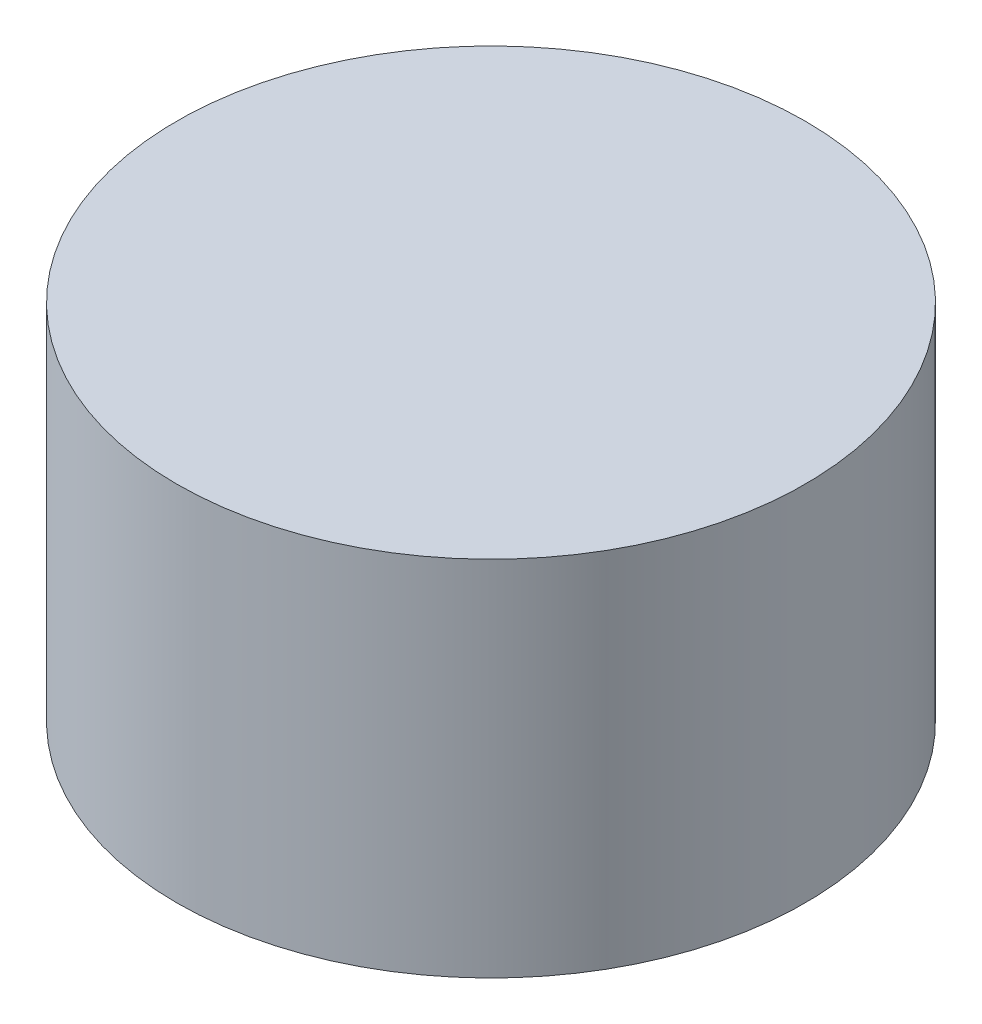
ISO-10303-21;
HEADER;
FILE_DESCRIPTION(('STEP AP214'),'2;1');
FILE_NAME('part.step','',(''),(''),'','','');
FILE_SCHEMA(('AUTOMOTIVE_DESIGN { 1 0 10303 214 1 1 1 1 }'));
ENDSEC;
DATA;
#1=APPLICATION_CONTEXT('core data for automotive mechanical design processes');
#2=APPLICATION_PROTOCOL_DEFINITION('international standard','automotive_design',2000,#1);
#3=PRODUCT_CONTEXT('',#1,'mechanical');
#4=PRODUCT('Part','Part','',(#3));
#5=PRODUCT_RELATED_PRODUCT_CATEGORY('part','',(#4));
#6=PRODUCT_DEFINITION_FORMATION('','',#4);
#7=PRODUCT_DEFINITION_CONTEXT('part definition',#1,'design');
#8=PRODUCT_DEFINITION('design','',#6,#7);
#9=PRODUCT_DEFINITION_SHAPE('','',#8);
#10=(LENGTH_UNIT() NAMED_UNIT(*) SI_UNIT(.MILLI.,.METRE.));
#11=(NAMED_UNIT(*) PLANE_ANGLE_UNIT() SI_UNIT($,.RADIAN.));
#12=(NAMED_UNIT(*) SI_UNIT($,.STERADIAN.) SOLID_ANGLE_UNIT());
#13=UNCERTAINTY_MEASURE_WITH_UNIT(LENGTH_MEASURE(1.E-05),#10,'distance_accuracy_value','');
#14=(GEOMETRIC_REPRESENTATION_CONTEXT(3) GLOBAL_UNCERTAINTY_ASSIGNED_CONTEXT((#13)) GLOBAL_UNIT_ASSIGNED_CONTEXT((#10,
#11,#12)) REPRESENTATION_CONTEXT('',''));
#15=CARTESIAN_POINT('',(0.,0.,0.));
#16=DIRECTION('',(0.,0.,1.));
#17=DIRECTION('',(1.,0.,0.));
#18=AXIS2_PLACEMENT_3D('',#15,#16,#17);
#19=CARTESIAN_POINT('',(0.,540.,0.));
#20=DIRECTION('',(0.,-1.,0.));
#21=DIRECTION('',(0.,0.,-1.));
#22=AXIS2_PLACEMENT_3D('',#19,#20,#21);
#23=CYLINDRICAL_SURFACE('',#22,260.);
#24=CARTESIAN_POINT('',(0.,540.,0.));
#25=DIRECTION('',(0.,1.,0.));
#26=DIRECTION('',(0.,0.,1.));
#27=AXIS2_PLACEMENT_3D('',#24,#25,#26);
#28=CIRCLE('',#27,260.);
#29=CARTESIAN_POINT('',(0.,540.,260.));
#30=VERTEX_POINT('',#29);
#31=EDGE_CURVE('E10',#30,#30,#28,.T.);
#32=ORIENTED_EDGE('',*,*,#31,.F.);
#33=EDGE_LOOP('',(#32));
#34=FACE_BOUND('',#33,.T.);
#35=CARTESIAN_POINT('',(0.,240.,0.));
#36=DIRECTION('',(0.,1.,0.));
#37=DIRECTION('',(0.,0.,1.));
#38=AXIS2_PLACEMENT_3D('',#35,#36,#37);
#39=CIRCLE('',#38,260.);
#40=CARTESIAN_POINT('',(0.,240.,260.));
#41=VERTEX_POINT('',#40);
#42=EDGE_CURVE('E34',#41,#41,#39,.T.);
#43=ORIENTED_EDGE('',*,*,#42,.T.);
#44=EDGE_LOOP('',(#43));
#45=FACE_BOUND('',#44,.T.);
#46=ADVANCED_FACE('F31',(#34,#45),#23,.T.);
#47=CARTESIAN_POINT('',(0.,540.,0.));
#48=DIRECTION('',(0.,1.,0.));
#49=DIRECTION('',(0.,0.,1.));
#50=AXIS2_PLACEMENT_3D('',#47,#48,#49);
#51=PLANE('',#50);
#52=ORIENTED_EDGE('',*,*,#31,.T.);
#53=EDGE_LOOP('',(#52));
#54=FACE_BOUND('',#53,.T.);
#55=ADVANCED_FACE('F46',(#54),#51,.T.);
#56=CARTESIAN_POINT('',(0.,240.,0.));
#57=DIRECTION('',(0.,1.,0.));
#58=DIRECTION('',(0.,0.,1.));
#59=AXIS2_PLACEMENT_3D('',#56,#57,#58);
#60=PLANE('',#59);
#61=ORIENTED_EDGE('',*,*,#42,.F.);
#62=EDGE_LOOP('',(#61));
#63=FACE_BOUND('',#62,.T.);
#64=ADVANCED_FACE('F44',(#63),#60,.F.);
#65=CLOSED_SHELL('',(#46,#55,#64));
#66=MANIFOLD_SOLID_BREP('B2',#65);
#67=ADVANCED_BREP_SHAPE_REPRESENTATION('',(#18,#66),#14);
#68=SHAPE_DEFINITION_REPRESENTATION(#9,#67);
ENDSEC;
END-ISO-10303-21;
